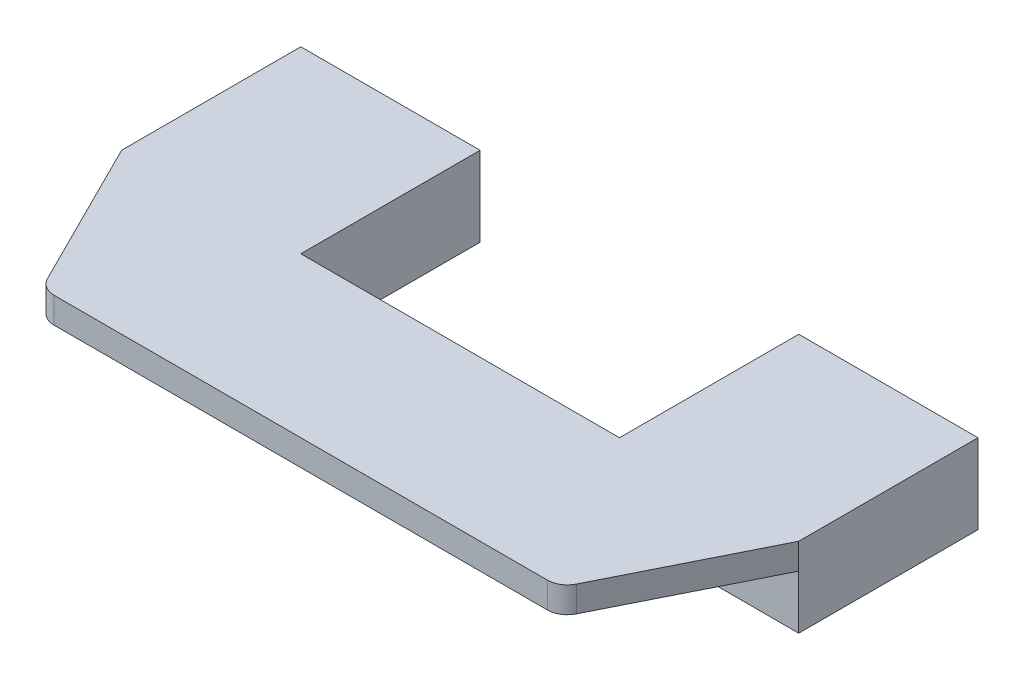
ISO-10303-21;
HEADER;
FILE_DESCRIPTION(('STEP AP214'),'2;1');
FILE_NAME('part.step','',(''),(''),'','','');
FILE_SCHEMA(('AUTOMOTIVE_DESIGN { 1 0 10303 214 1 1 1 1 }'));
ENDSEC;
DATA;
#1=APPLICATION_CONTEXT('core data for automotive mechanical design processes');
#2=APPLICATION_PROTOCOL_DEFINITION('international standard','automotive_design',2000,#1);
#3=PRODUCT_CONTEXT('',#1,'mechanical');
#4=PRODUCT('Part','Part','',(#3));
#5=PRODUCT_RELATED_PRODUCT_CATEGORY('part','',(#4));
#6=PRODUCT_DEFINITION_FORMATION('','',#4);
#7=PRODUCT_DEFINITION_CONTEXT('part definition',#1,'design');
#8=PRODUCT_DEFINITION('design','',#6,#7);
#9=PRODUCT_DEFINITION_SHAPE('','',#8);
#10=(LENGTH_UNIT() NAMED_UNIT(*) SI_UNIT(.MILLI.,.METRE.));
#11=(NAMED_UNIT(*) PLANE_ANGLE_UNIT() SI_UNIT($,.RADIAN.));
#12=(NAMED_UNIT(*) SI_UNIT($,.STERADIAN.) SOLID_ANGLE_UNIT());
#13=UNCERTAINTY_MEASURE_WITH_UNIT(LENGTH_MEASURE(1.E-05),#10,'distance_accuracy_value','');
#14=(GEOMETRIC_REPRESENTATION_CONTEXT(3) GLOBAL_UNCERTAINTY_ASSIGNED_CONTEXT((#13)) GLOBAL_UNIT_ASSIGNED_CONTEXT((#10,
#11,#12)) REPRESENTATION_CONTEXT('',''));
#15=CARTESIAN_POINT('',(0.,0.,0.));
#16=DIRECTION('',(0.,0.,1.));
#17=DIRECTION('',(1.,0.,0.));
#18=AXIS2_PLACEMENT_3D('',#15,#16,#17);
#19=CARTESIAN_POINT('',(0.,0.,0.));
#20=DIRECTION('',(0.,1.,0.));
#21=DIRECTION('',(0.,0.,1.));
#22=AXIS2_PLACEMENT_3D('',#19,#20,#21);
#23=PLANE('',#22);
#24=DIRECTION('',(0.,0.,-1.));
#25=VECTOR('',#24,1.);
#26=CARTESIAN_POINT('',(17.,0.,-8.5));
#27=LINE('',#26,#25);
#28=CARTESIAN_POINT('',(17.,0.,0.5));
#29=VERTEX_POINT('',#28);
#30=CARTESIAN_POINT('',(17.,0.,-8.5));
#31=VERTEX_POINT('',#30);
#32=EDGE_CURVE('E174',#29,#31,#27,.T.);
#33=ORIENTED_EDGE('',*,*,#32,.F.);
#34=DIRECTION('',(1.,0.,0.));
#35=VECTOR('',#34,1.);
#36=CARTESIAN_POINT('',(-17.,0.,0.5));
#37=LINE('',#36,#35);
#38=CARTESIAN_POINT('',(8.,0.,0.5));
#39=VERTEX_POINT('',#38);
#40=EDGE_CURVE('E224',#39,#29,#37,.T.);
#41=ORIENTED_EDGE('',*,*,#40,.F.);
#42=DIRECTION('',(0.,0.,-1.));
#43=VECTOR('',#42,1.);
#44=CARTESIAN_POINT('',(8.,0.,0.));
#45=LINE('',#44,#43);
#46=CARTESIAN_POINT('',(8.,0.,-8.5));
#47=VERTEX_POINT('',#46);
#48=EDGE_CURVE('E191',#39,#47,#45,.T.);
#49=ORIENTED_EDGE('',*,*,#48,.T.);
#50=DIRECTION('',(-1.,0.,0.));
#51=VECTOR('',#50,1.);
#52=CARTESIAN_POINT('',(-17.,0.,-8.5));
#53=LINE('',#52,#51);
#54=EDGE_CURVE('E178',#31,#47,#53,.T.);
#55=ORIENTED_EDGE('',*,*,#54,.F.);
#56=EDGE_LOOP('',(#33,#41,#49,#55));
#57=FACE_BOUND('',#56,.T.);
#58=ADVANCED_FACE('F37',(#57),#23,.F.);
#59=CARTESIAN_POINT('',(-17.,4.,-8.5));
#60=DIRECTION('',(0.,0.,1.));
#61=DIRECTION('',(1.,0.,0.));
#62=AXIS2_PLACEMENT_3D('',#59,#60,#61);
#63=PLANE('',#62);
#64=ORIENTED_EDGE('',*,*,#54,.T.);
#65=DIRECTION('',(0.,1.,0.));
#66=VECTOR('',#65,1.);
#67=CARTESIAN_POINT('',(8.,-1.,-8.5));
#68=LINE('',#67,#66);
#69=CARTESIAN_POINT('',(8.,4.,-8.5));
#70=VERTEX_POINT('',#69);
#71=EDGE_CURVE('E238',#47,#70,#68,.T.);
#72=ORIENTED_EDGE('',*,*,#71,.T.);
#73=DIRECTION('',(-1.,0.,0.));
#74=VECTOR('',#73,1.);
#75=CARTESIAN_POINT('',(-17.,4.,-8.5));
#76=LINE('',#75,#74);
#77=CARTESIAN_POINT('',(17.,4.,-8.5));
#78=VERTEX_POINT('',#77);
#79=EDGE_CURVE('E166',#78,#70,#76,.T.);
#80=ORIENTED_EDGE('',*,*,#79,.F.);
#81=DIRECTION('',(0.,-1.,0.));
#82=VECTOR('',#81,1.);
#83=CARTESIAN_POINT('',(17.,4.,-8.5));
#84=LINE('',#83,#82);
#85=EDGE_CURVE('E185',#78,#31,#84,.T.);
#86=ORIENTED_EDGE('',*,*,#85,.T.);
#87=EDGE_LOOP('',(#64,#72,#80,#86));
#88=FACE_BOUND('',#87,.T.);
#89=ADVANCED_FACE('F256',(#88),#63,.F.);
#90=CARTESIAN_POINT('',(17.,4.,-8.5));
#91=DIRECTION('',(-1.,0.,0.));
#92=DIRECTION('',(0.,0.,1.));
#93=AXIS2_PLACEMENT_3D('',#90,#91,#92);
#94=PLANE('',#93);
#95=DIRECTION('',(0.,0.,-1.));
#96=VECTOR('',#95,1.);
#97=CARTESIAN_POINT('',(17.,4.,-8.5));
#98=LINE('',#97,#96);
#99=CARTESIAN_POINT('',(17.,4.,0.5));
#100=VERTEX_POINT('',#99);
#101=EDGE_CURVE('E183',#100,#78,#98,.T.);
#102=ORIENTED_EDGE('',*,*,#101,.F.);
#103=DIRECTION('',(0.,1.,0.));
#104=VECTOR('',#103,1.);
#105=CARTESIAN_POINT('',(17.,1.,0.5));
#106=LINE('',#105,#104);
#107=CARTESIAN_POINT('',(17.,2.7,0.5));
#108=VERTEX_POINT('',#107);
#109=EDGE_CURVE('E148',#108,#100,#106,.T.);
#110=ORIENTED_EDGE('',*,*,#109,.F.);
#111=DIRECTION('',(0.,1.,0.));
#112=VECTOR('',#111,1.);
#113=CARTESIAN_POINT('',(17.,0.,0.5));
#114=LINE('',#113,#112);
#115=EDGE_CURVE('E261',#29,#108,#114,.T.);
#116=ORIENTED_EDGE('',*,*,#115,.F.);
#117=ORIENTED_EDGE('',*,*,#32,.T.);
#118=ORIENTED_EDGE('',*,*,#85,.F.);
#119=EDGE_LOOP('',(#102,#110,#116,#117,#118));
#120=FACE_BOUND('',#119,.T.);
#121=ADVANCED_FACE('F257',(#120),#94,.F.);
#122=CARTESIAN_POINT('',(-8.,4.,-8.5));
#123=VERTEX_POINT('',#122);
#124=CARTESIAN_POINT('',(-17.,4.,-8.5));
#125=VERTEX_POINT('',#124);
#126=EDGE_CURVE('E163',#123,#125,#76,.T.);
#127=ORIENTED_EDGE('',*,*,#126,.F.);
#128=DIRECTION('',(0.,1.,0.));
#129=VECTOR('',#128,1.);
#130=CARTESIAN_POINT('',(-8.,-1.,-8.5));
#131=LINE('',#130,#129);
#132=CARTESIAN_POINT('',(-8.,0.,-8.5));
#133=VERTEX_POINT('',#132);
#134=EDGE_CURVE('E245',#133,#123,#131,.T.);
#135=ORIENTED_EDGE('',*,*,#134,.F.);
#136=CARTESIAN_POINT('',(-17.,0.,-8.5));
#137=VERTEX_POINT('',#136);
#138=EDGE_CURVE('E176',#133,#137,#53,.T.);
#139=ORIENTED_EDGE('',*,*,#138,.T.);
#140=DIRECTION('',(0.,-1.,0.));
#141=VECTOR('',#140,1.);
#142=CARTESIAN_POINT('',(-17.,4.,-8.5));
#143=LINE('',#142,#141);
#144=EDGE_CURVE('E168',#125,#137,#143,.T.);
#145=ORIENTED_EDGE('',*,*,#144,.F.);
#146=EDGE_LOOP('',(#127,#135,#139,#145));
#147=FACE_BOUND('',#146,.T.);
#148=ADVANCED_FACE('F280',(#147),#63,.F.);
#149=CARTESIAN_POINT('',(-17.,4.,-8.5));
#150=DIRECTION('',(1.,0.,0.));
#151=DIRECTION('',(0.,0.,-1.));
#152=AXIS2_PLACEMENT_3D('',#149,#150,#151);
#153=PLANE('',#152);
#154=DIRECTION('',(0.,-1.,0.));
#155=VECTOR('',#154,1.);
#156=CARTESIAN_POINT('',(-17.,0.,0.5));
#157=LINE('',#156,#155);
#158=CARTESIAN_POINT('',(-17.,2.7,0.5));
#159=VERTEX_POINT('',#158);
#160=CARTESIAN_POINT('',(-17.,0.,0.5));
#161=VERTEX_POINT('',#160);
#162=EDGE_CURVE('E157',#159,#161,#157,.T.);
#163=ORIENTED_EDGE('',*,*,#162,.F.);
#164=DIRECTION('',(0.,1.,0.));
#165=VECTOR('',#164,1.);
#166=CARTESIAN_POINT('',(-17.,1.,0.5));
#167=LINE('',#166,#165);
#168=CARTESIAN_POINT('',(-17.,4.,0.5));
#169=VERTEX_POINT('',#168);
#170=EDGE_CURVE('E143',#159,#169,#167,.T.);
#171=ORIENTED_EDGE('',*,*,#170,.T.);
#172=DIRECTION('',(0.,0.,1.));
#173=VECTOR('',#172,1.);
#174=CARTESIAN_POINT('',(-17.,4.,-8.5));
#175=LINE('',#174,#173);
#176=EDGE_CURVE('E155',#125,#169,#175,.T.);
#177=ORIENTED_EDGE('',*,*,#176,.F.);
#178=ORIENTED_EDGE('',*,*,#144,.T.);
#179=DIRECTION('',(0.,0.,1.));
#180=VECTOR('',#179,1.);
#181=CARTESIAN_POINT('',(-17.,0.,-8.5));
#182=LINE('',#181,#180);
#183=EDGE_CURVE('E181',#137,#161,#182,.T.);
#184=ORIENTED_EDGE('',*,*,#183,.T.);
#185=EDGE_LOOP('',(#163,#171,#177,#178,#184));
#186=FACE_BOUND('',#185,.T.);
#187=ADVANCED_FACE('F153',(#186),#153,.F.);
#188=CARTESIAN_POINT('',(-17.,4.,8.5));
#189=DIRECTION('',(0.,0.,-1.));
#190=DIRECTION('',(-1.,0.,0.));
#191=AXIS2_PLACEMENT_3D('',#188,#189,#190);
#192=PLANE('',#191);
#193=DIRECTION('',(-1.,0.,0.));
#194=VECTOR('',#193,1.);
#195=CARTESIAN_POINT('',(-17.,2.7,8.5));
#196=LINE('',#195,#194);
#197=CARTESIAN_POINT('',(12.3819660112501,2.7,8.5));
#198=VERTEX_POINT('',#197);
#199=CARTESIAN_POINT('',(-12.3819660112501,2.7,8.5));
#200=VERTEX_POINT('',#199);
#201=EDGE_CURVE('E158',#198,#200,#196,.T.);
#202=ORIENTED_EDGE('',*,*,#201,.F.);
#203=DIRECTION('',(0.,1.,0.));
#204=VECTOR('',#203,1.);
#205=CARTESIAN_POINT('',(12.3819660112501,4.,8.5));
#206=LINE('',#205,#204);
#207=CARTESIAN_POINT('',(12.3819660112501,4.,8.5));
#208=VERTEX_POINT('',#207);
#209=EDGE_CURVE('E206',#198,#208,#206,.T.);
#210=ORIENTED_EDGE('',*,*,#209,.T.);
#211=DIRECTION('',(1.,0.,0.));
#212=VECTOR('',#211,1.);
#213=CARTESIAN_POINT('',(-17.,4.,8.5));
#214=LINE('',#213,#212);
#215=CARTESIAN_POINT('',(-12.3819660112501,4.,8.5));
#216=VERTEX_POINT('',#215);
#217=EDGE_CURVE('E165',#216,#208,#214,.T.);
#218=ORIENTED_EDGE('',*,*,#217,.F.);
#219=DIRECTION('',(0.,1.,0.));
#220=VECTOR('',#219,1.);
#221=CARTESIAN_POINT('',(-12.3819660112501,4.,8.5));
#222=LINE('',#221,#220);
#223=EDGE_CURVE('E201',#216,#200,#222,.F.);
#224=ORIENTED_EDGE('',*,*,#223,.T.);
#225=EDGE_LOOP('',(#202,#210,#218,#224));
#226=FACE_BOUND('',#225,.T.);
#227=ADVANCED_FACE('F213',(#226),#192,.F.);
#228=CARTESIAN_POINT('',(0.,4.,0.));
#229=DIRECTION('',(0.,1.,0.));
#230=DIRECTION('',(0.,0.,1.));
#231=AXIS2_PLACEMENT_3D('',#228,#229,#230);
#232=PLANE('',#231);
#233=ORIENTED_EDGE('',*,*,#217,.T.);
#234=CARTESIAN_POINT('',(12.3819660112501,4.,7.5));
#235=DIRECTION('',(0.,1.,0.));
#236=DIRECTION('',(0.,0.,1.));
#237=AXIS2_PLACEMENT_3D('',#234,#235,#236);
#238=CIRCLE('',#237,1.);
#239=CARTESIAN_POINT('',(13.27639320225,4.,7.94721359549996));
#240=VERTEX_POINT('',#239);
#241=EDGE_CURVE('E59',#208,#240,#238,.T.);
#242=ORIENTED_EDGE('',*,*,#241,.T.);
#243=DIRECTION('',(-0.447213595499958,0.,0.894427190999916));
#244=VECTOR('',#243,1.);
#245=CARTESIAN_POINT('',(17.,4.,0.5));
#246=LINE('',#245,#244);
#247=EDGE_CURVE('E251',#100,#240,#246,.T.);
#248=ORIENTED_EDGE('',*,*,#247,.F.);
#249=ORIENTED_EDGE('',*,*,#101,.T.);
#250=ORIENTED_EDGE('',*,*,#79,.T.);
#251=DIRECTION('',(0.,0.,-1.));
#252=VECTOR('',#251,1.);
#253=CARTESIAN_POINT('',(8.,4.,0.499999999999999));
#254=LINE('',#253,#252);
#255=CARTESIAN_POINT('',(8.,4.,0.499999999999999));
#256=VERTEX_POINT('',#255);
#257=EDGE_CURVE('E230',#256,#70,#254,.T.);
#258=ORIENTED_EDGE('',*,*,#257,.F.);
#259=DIRECTION('',(1.,0.,0.));
#260=VECTOR('',#259,1.);
#261=CARTESIAN_POINT('',(-8.,4.,0.499999999999999));
#262=LINE('',#261,#260);
#263=CARTESIAN_POINT('',(-8.,4.,0.499999999999999));
#264=VERTEX_POINT('',#263);
#265=EDGE_CURVE('E235',#264,#256,#262,.T.);
#266=ORIENTED_EDGE('',*,*,#265,.F.);
#267=DIRECTION('',(0.,0.,1.));
#268=VECTOR('',#267,1.);
#269=CARTESIAN_POINT('',(-8.,4.,0.499999999999999));
#270=LINE('',#269,#268);
#271=EDGE_CURVE('E232',#123,#264,#270,.T.);
#272=ORIENTED_EDGE('',*,*,#271,.F.);
#273=ORIENTED_EDGE('',*,*,#126,.T.);
#274=ORIENTED_EDGE('',*,*,#176,.T.);
#275=DIRECTION('',(-0.447213595499958,0.,-0.894427190999916));
#276=VECTOR('',#275,1.);
#277=CARTESIAN_POINT('',(-17.,4.,0.5));
#278=LINE('',#277,#276);
#279=CARTESIAN_POINT('',(-13.27639320225,4.,7.94721359549996));
#280=VERTEX_POINT('',#279);
#281=EDGE_CURVE('E139',#280,#169,#278,.T.);
#282=ORIENTED_EDGE('',*,*,#281,.F.);
#283=CARTESIAN_POINT('',(-12.3819660112501,4.,7.5));
#284=DIRECTION('',(0.,1.,0.));
#285=DIRECTION('',(0.,0.,1.));
#286=AXIS2_PLACEMENT_3D('',#283,#284,#285);
#287=CIRCLE('',#286,1.);
#288=EDGE_CURVE('E199',#280,#216,#287,.T.);
#289=ORIENTED_EDGE('',*,*,#288,.T.);
#290=EDGE_LOOP('',(#233,#242,#248,#249,#250,#258,#266,#272,#273,#274,#282,#289));
#291=FACE_BOUND('',#290,.T.);
#292=ADVANCED_FACE('F160',(#291),#232,.T.);
#293=DIRECTION('',(0.,0.,1.));
#294=VECTOR('',#293,1.);
#295=CARTESIAN_POINT('',(-8.,0.,0.));
#296=LINE('',#295,#294);
#297=CARTESIAN_POINT('',(-8.,0.,0.499999999999999));
#298=VERTEX_POINT('',#297);
#299=EDGE_CURVE('E188',#133,#298,#296,.T.);
#300=ORIENTED_EDGE('',*,*,#299,.T.);
#301=EDGE_CURVE('E285',#161,#298,#37,.T.);
#302=ORIENTED_EDGE('',*,*,#301,.F.);
#303=ORIENTED_EDGE('',*,*,#183,.F.);
#304=ORIENTED_EDGE('',*,*,#138,.F.);
#305=EDGE_LOOP('',(#300,#302,#303,#304));
#306=FACE_BOUND('',#305,.T.);
#307=ADVANCED_FACE('F283',(#306),#23,.F.);
#308=CARTESIAN_POINT('',(8.,-1.,0.499999999999999));
#309=DIRECTION('',(1.,0.,0.));
#310=DIRECTION('',(0.,0.,-1.));
#311=AXIS2_PLACEMENT_3D('',#308,#309,#310);
#312=PLANE('',#311);
#313=DIRECTION('',(0.,1.,0.));
#314=VECTOR('',#313,1.);
#315=CARTESIAN_POINT('',(8.,-1.,0.499999999999999));
#316=LINE('',#315,#314);
#317=CARTESIAN_POINT('',(8.,2.7,0.5));
#318=VERTEX_POINT('',#317);
#319=EDGE_CURVE('E177',#39,#318,#316,.T.);
#320=ORIENTED_EDGE('',*,*,#319,.T.);
#321=EDGE_CURVE('E241',#318,#256,#316,.T.);
#322=ORIENTED_EDGE('',*,*,#321,.T.);
#323=ORIENTED_EDGE('',*,*,#257,.T.);
#324=ORIENTED_EDGE('',*,*,#71,.F.);
#325=ORIENTED_EDGE('',*,*,#48,.F.);
#326=EDGE_LOOP('',(#320,#322,#323,#324,#325));
#327=FACE_BOUND('',#326,.T.);
#328=ADVANCED_FACE('F266',(#327),#312,.F.);
#329=CARTESIAN_POINT('',(-8.,-1.,0.499999999999999));
#330=DIRECTION('',(0.,0.,1.));
#331=DIRECTION('',(1.,0.,0.));
#332=AXIS2_PLACEMENT_3D('',#329,#330,#331);
#333=PLANE('',#332);
#334=ORIENTED_EDGE('',*,*,#321,.F.);
#335=DIRECTION('',(-1.,0.,0.));
#336=VECTOR('',#335,1.);
#337=CARTESIAN_POINT('',(-17.,2.7,0.5));
#338=LINE('',#337,#336);
#339=CARTESIAN_POINT('',(-8.,2.7,0.5));
#340=VERTEX_POINT('',#339);
#341=EDGE_CURVE('E273',#318,#340,#338,.T.);
#342=ORIENTED_EDGE('',*,*,#341,.T.);
#343=DIRECTION('',(0.,1.,0.));
#344=VECTOR('',#343,1.);
#345=CARTESIAN_POINT('',(-8.,-1.,0.499999999999999));
#346=LINE('',#345,#344);
#347=EDGE_CURVE('E244',#340,#264,#346,.T.);
#348=ORIENTED_EDGE('',*,*,#347,.T.);
#349=ORIENTED_EDGE('',*,*,#265,.T.);
#350=EDGE_LOOP('',(#334,#342,#348,#349));
#351=FACE_BOUND('',#350,.T.);
#352=ADVANCED_FACE('F270',(#351),#333,.F.);
#353=CARTESIAN_POINT('',(-8.,-1.,0.499999999999999));
#354=DIRECTION('',(-1.,0.,0.));
#355=DIRECTION('',(0.,0.,1.));
#356=AXIS2_PLACEMENT_3D('',#353,#354,#355);
#357=PLANE('',#356);
#358=ORIENTED_EDGE('',*,*,#134,.T.);
#359=ORIENTED_EDGE('',*,*,#271,.T.);
#360=ORIENTED_EDGE('',*,*,#347,.F.);
#361=EDGE_CURVE('E242',#298,#340,#346,.T.);
#362=ORIENTED_EDGE('',*,*,#361,.F.);
#363=ORIENTED_EDGE('',*,*,#299,.F.);
#364=EDGE_LOOP('',(#358,#359,#360,#362,#363));
#365=FACE_BOUND('',#364,.T.);
#366=ADVANCED_FACE('F276',(#365),#357,.F.);
#367=CARTESIAN_POINT('',(0.,0.,0.5));
#368=DIRECTION('',(0.,0.,-1.));
#369=DIRECTION('',(-1.,0.,0.));
#370=AXIS2_PLACEMENT_3D('',#367,#368,#369);
#371=PLANE('',#370);
#372=ORIENTED_EDGE('',*,*,#40,.T.);
#373=ORIENTED_EDGE('',*,*,#115,.T.);
#374=EDGE_CURVE('E228',#108,#318,#338,.T.);
#375=ORIENTED_EDGE('',*,*,#374,.T.);
#376=ORIENTED_EDGE('',*,*,#319,.F.);
#377=EDGE_LOOP('',(#372,#373,#375,#376));
#378=FACE_BOUND('',#377,.T.);
#379=ADVANCED_FACE('F316',(#378),#371,.F.);
#380=EDGE_CURVE('E288',#340,#159,#338,.T.);
#381=ORIENTED_EDGE('',*,*,#380,.T.);
#382=ORIENTED_EDGE('',*,*,#162,.T.);
#383=ORIENTED_EDGE('',*,*,#301,.T.);
#384=ORIENTED_EDGE('',*,*,#361,.T.);
#385=EDGE_LOOP('',(#381,#382,#383,#384));
#386=FACE_BOUND('',#385,.T.);
#387=ADVANCED_FACE('F321',(#386),#371,.F.);
#388=CARTESIAN_POINT('',(-17.,2.7,0.5));
#389=DIRECTION('',(0.,1.,0.));
#390=DIRECTION('',(0.,0.,1.));
#391=AXIS2_PLACEMENT_3D('',#388,#389,#390);
#392=PLANE('',#391);
#393=DIRECTION('',(-0.447213595499958,0.,0.894427190999916));
#394=VECTOR('',#393,1.);
#395=CARTESIAN_POINT('',(10.2,2.7,14.1));
#396=LINE('',#395,#394);
#397=CARTESIAN_POINT('',(13.27639320225,2.7,7.94721359549996));
#398=VERTEX_POINT('',#397);
#399=EDGE_CURVE('E194',#108,#398,#396,.T.);
#400=ORIENTED_EDGE('',*,*,#399,.T.);
#401=CARTESIAN_POINT('',(12.3819660112501,2.7,7.5));
#402=DIRECTION('',(0.,1.,0.));
#403=DIRECTION('',(0.,0.,1.));
#404=AXIS2_PLACEMENT_3D('',#401,#402,#403);
#405=CIRCLE('',#404,1.);
#406=EDGE_CURVE('E11',#398,#198,#405,.F.);
#407=ORIENTED_EDGE('',*,*,#406,.T.);
#408=ORIENTED_EDGE('',*,*,#201,.T.);
#409=CARTESIAN_POINT('',(-12.3819660112501,2.7,7.5));
#410=DIRECTION('',(0.,1.,0.));
#411=DIRECTION('',(0.,0.,1.));
#412=AXIS2_PLACEMENT_3D('',#409,#410,#411);
#413=CIRCLE('',#412,1.);
#414=CARTESIAN_POINT('',(-13.27639320225,2.7,7.94721359549996));
#415=VERTEX_POINT('',#414);
#416=EDGE_CURVE('E204',#200,#415,#413,.F.);
#417=ORIENTED_EDGE('',*,*,#416,.T.);
#418=DIRECTION('',(-0.447213595499958,0.,-0.894427190999916));
#419=VECTOR('',#418,1.);
#420=CARTESIAN_POINT('',(-17.,2.7,0.5));
#421=LINE('',#420,#419);
#422=EDGE_CURVE('E196',#415,#159,#421,.T.);
#423=ORIENTED_EDGE('',*,*,#422,.T.);
#424=ORIENTED_EDGE('',*,*,#380,.F.);
#425=ORIENTED_EDGE('',*,*,#341,.F.);
#426=ORIENTED_EDGE('',*,*,#374,.F.);
#427=EDGE_LOOP('',(#400,#407,#408,#417,#423,#424,#425,#426));
#428=FACE_BOUND('',#427,.T.);
#429=ADVANCED_FACE('F221',(#428),#392,.F.);
#430=CARTESIAN_POINT('',(17.,1.,0.5));
#431=DIRECTION('',(-0.894427190999916,0.,-0.447213595499958));
#432=DIRECTION('',(-0.447213595499958,0.,0.894427190999916));
#433=AXIS2_PLACEMENT_3D('',#430,#431,#432);
#434=PLANE('',#433);
#435=ORIENTED_EDGE('',*,*,#247,.T.);
#436=DIRECTION('',(0.,1.,0.));
#437=VECTOR('',#436,1.);
#438=CARTESIAN_POINT('',(13.27639320225,1.,7.94721359549996));
#439=LINE('',#438,#437);
#440=EDGE_CURVE('E45',#240,#398,#439,.F.);
#441=ORIENTED_EDGE('',*,*,#440,.T.);
#442=ORIENTED_EDGE('',*,*,#399,.F.);
#443=ORIENTED_EDGE('',*,*,#109,.T.);
#444=EDGE_LOOP('',(#435,#441,#442,#443));
#445=FACE_BOUND('',#444,.T.);
#446=ADVANCED_FACE('F291',(#445),#434,.F.);
#447=CARTESIAN_POINT('',(-17.,1.,0.5));
#448=DIRECTION('',(0.894427190999916,0.,-0.447213595499958));
#449=DIRECTION('',(-0.447213595499958,0.,-0.894427190999916));
#450=AXIS2_PLACEMENT_3D('',#447,#448,#449);
#451=PLANE('',#450);
#452=ORIENTED_EDGE('',*,*,#422,.F.);
#453=DIRECTION('',(0.,1.,0.));
#454=VECTOR('',#453,1.);
#455=CARTESIAN_POINT('',(-13.27639320225,1.,7.94721359549996));
#456=LINE('',#455,#454);
#457=EDGE_CURVE('E146',#415,#280,#456,.T.);
#458=ORIENTED_EDGE('',*,*,#457,.T.);
#459=ORIENTED_EDGE('',*,*,#281,.T.);
#460=ORIENTED_EDGE('',*,*,#170,.F.);
#461=EDGE_LOOP('',(#452,#458,#459,#460));
#462=FACE_BOUND('',#461,.T.);
#463=ADVANCED_FACE('F142',(#462),#451,.F.);
#464=CARTESIAN_POINT('',(-12.3819660112501,1.,7.5));
#465=DIRECTION('',(0.,1.,0.));
#466=DIRECTION('',(0.,0.,1.));
#467=AXIS2_PLACEMENT_3D('',#464,#465,#466);
#468=CYLINDRICAL_SURFACE('',#467,1.);
#469=ORIENTED_EDGE('',*,*,#416,.F.);
#470=ORIENTED_EDGE('',*,*,#223,.F.);
#471=ORIENTED_EDGE('',*,*,#288,.F.);
#472=ORIENTED_EDGE('',*,*,#457,.F.);
#473=EDGE_LOOP('',(#469,#470,#471,#472));
#474=FACE_BOUND('',#473,.T.);
#475=ADVANCED_FACE('F219',(#474),#468,.T.);
#476=CARTESIAN_POINT('',(12.3819660112501,4.,7.5));
#477=DIRECTION('',(0.,1.,0.));
#478=DIRECTION('',(0.,0.,1.));
#479=AXIS2_PLACEMENT_3D('',#476,#477,#478);
#480=CYLINDRICAL_SURFACE('',#479,1.);
#481=ORIENTED_EDGE('',*,*,#406,.F.);
#482=ORIENTED_EDGE('',*,*,#440,.F.);
#483=ORIENTED_EDGE('',*,*,#241,.F.);
#484=ORIENTED_EDGE('',*,*,#209,.F.);
#485=EDGE_LOOP('',(#481,#482,#483,#484));
#486=FACE_BOUND('',#485,.T.);
#487=ADVANCED_FACE('F39',(#486),#480,.T.);
#488=CLOSED_SHELL('',(#58,#89,#121,#148,#187,#227,#292,#307,#328,#352,#366,#379,#387,#429,#446,
#463,#475,#487));
#489=MANIFOLD_SOLID_BREP('B2',#488);
#490=ADVANCED_BREP_SHAPE_REPRESENTATION('',(#18,#489),#14);
#491=SHAPE_DEFINITION_REPRESENTATION(#9,#490);
ENDSEC;
END-ISO-10303-21;
